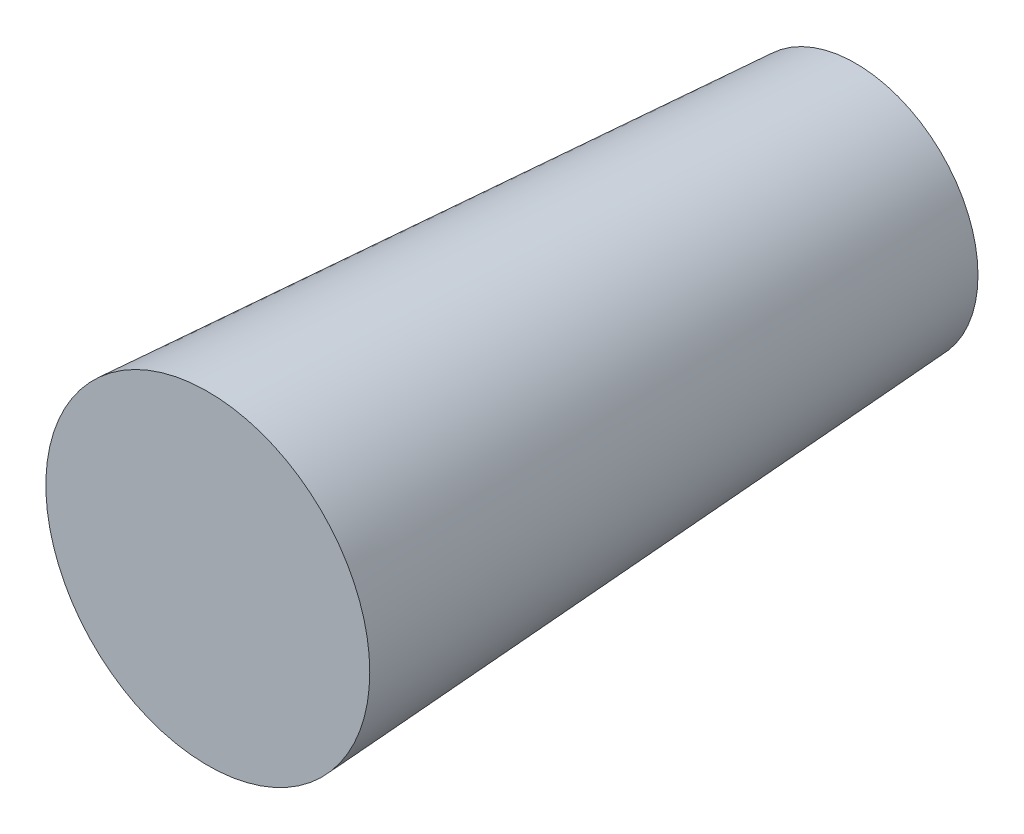
ISO-10303-21;
HEADER;
FILE_DESCRIPTION(('STEP AP214'),'2;1');
FILE_NAME('part.step','',(''),(''),'','','');
FILE_SCHEMA(('AUTOMOTIVE_DESIGN { 1 0 10303 214 1 1 1 1 }'));
ENDSEC;
DATA;
#1=APPLICATION_CONTEXT('core data for automotive mechanical design processes');
#2=APPLICATION_PROTOCOL_DEFINITION('international standard','automotive_design',2000,#1);
#3=PRODUCT_CONTEXT('',#1,'mechanical');
#4=PRODUCT('Part','Part','',(#3));
#5=PRODUCT_RELATED_PRODUCT_CATEGORY('part','',(#4));
#6=PRODUCT_DEFINITION_FORMATION('','',#4);
#7=PRODUCT_DEFINITION_CONTEXT('part definition',#1,'design');
#8=PRODUCT_DEFINITION('design','',#6,#7);
#9=PRODUCT_DEFINITION_SHAPE('','',#8);
#10=(LENGTH_UNIT() NAMED_UNIT(*) SI_UNIT(.MILLI.,.METRE.));
#11=(NAMED_UNIT(*) PLANE_ANGLE_UNIT() SI_UNIT($,.RADIAN.));
#12=(NAMED_UNIT(*) SI_UNIT($,.STERADIAN.) SOLID_ANGLE_UNIT());
#13=UNCERTAINTY_MEASURE_WITH_UNIT(LENGTH_MEASURE(1.E-05),#10,'distance_accuracy_value','');
#14=(GEOMETRIC_REPRESENTATION_CONTEXT(3) GLOBAL_UNCERTAINTY_ASSIGNED_CONTEXT((#13)) GLOBAL_UNIT_ASSIGNED_CONTEXT((#10,
#11,#12)) REPRESENTATION_CONTEXT('',''));
#15=CARTESIAN_POINT('',(0.,0.,0.));
#16=DIRECTION('',(0.,0.,1.));
#17=DIRECTION('',(1.,0.,0.));
#18=AXIS2_PLACEMENT_3D('',#15,#16,#17);
#19=CARTESIAN_POINT('',(0.,0.,0.));
#20=DIRECTION('',(0.,0.,1.));
#21=DIRECTION('',(1.,0.,0.));
#22=AXIS2_PLACEMENT_3D('',#19,#20,#21);
#23=PLANE('',#22);
#24=CARTESIAN_POINT('',(0.,0.,0.));
#25=DIRECTION('',(0.,0.,1.));
#26=DIRECTION('',(1.,0.,0.));
#27=AXIS2_PLACEMENT_3D('',#24,#25,#26);
#28=CIRCLE('',#27,3.4);
#29=CARTESIAN_POINT('',(3.4,0.,0.));
#30=VERTEX_POINT('',#29);
#31=EDGE_CURVE('E11',#30,#30,#28,.T.);
#32=ORIENTED_EDGE('',*,*,#31,.F.);
#33=EDGE_LOOP('',(#32));
#34=FACE_BOUND('',#33,.T.);
#35=ADVANCED_FACE('F33',(#34),#23,.F.);
#36=CARTESIAN_POINT('',(0.,0.,18.));
#37=DIRECTION('',(0.,0.,1.));
#38=DIRECTION('',(1.,0.,0.));
#39=AXIS2_PLACEMENT_3D('',#36,#37,#38);
#40=PLANE('',#39);
#41=CARTESIAN_POINT('',(0.,0.,18.));
#42=DIRECTION('',(0.,0.,1.));
#43=DIRECTION('',(1.,0.,0.));
#44=AXIS2_PLACEMENT_3D('',#41,#42,#43);
#45=CIRCLE('',#44,4.5);
#46=CARTESIAN_POINT('',(4.5,0.,18.));
#47=VERTEX_POINT('',#46);
#48=EDGE_CURVE('E41',#47,#47,#45,.T.);
#49=ORIENTED_EDGE('',*,*,#48,.T.);
#50=EDGE_LOOP('',(#49));
#51=FACE_BOUND('',#50,.T.);
#52=ADVANCED_FACE('F65',(#51),#40,.T.);
#53=CARTESIAN_POINT('',(0.,0.,0.));
#54=DIRECTION('',(0.,0.,1.));
#55=DIRECTION('',(1.,0.,0.));
#56=AXIS2_PLACEMENT_3D('',#53,#54,#55);
#57=CONICAL_SURFACE('',#56,3.4,0.061035206589689);
#58=ORIENTED_EDGE('',*,*,#48,.F.);
#59=EDGE_LOOP('',(#58));
#60=FACE_BOUND('',#59,.T.);
#61=ORIENTED_EDGE('',*,*,#31,.T.);
#62=EDGE_LOOP('',(#61));
#63=FACE_BOUND('',#62,.T.);
#64=ADVANCED_FACE('F73',(#60,#63),#57,.T.);
#65=CLOSED_SHELL('',(#35,#52,#64));
#66=MANIFOLD_SOLID_BREP('B2',#65);
#67=ADVANCED_BREP_SHAPE_REPRESENTATION('',(#18,#66),#14);
#68=SHAPE_DEFINITION_REPRESENTATION(#9,#67);
ENDSEC;
END-ISO-10303-21;
